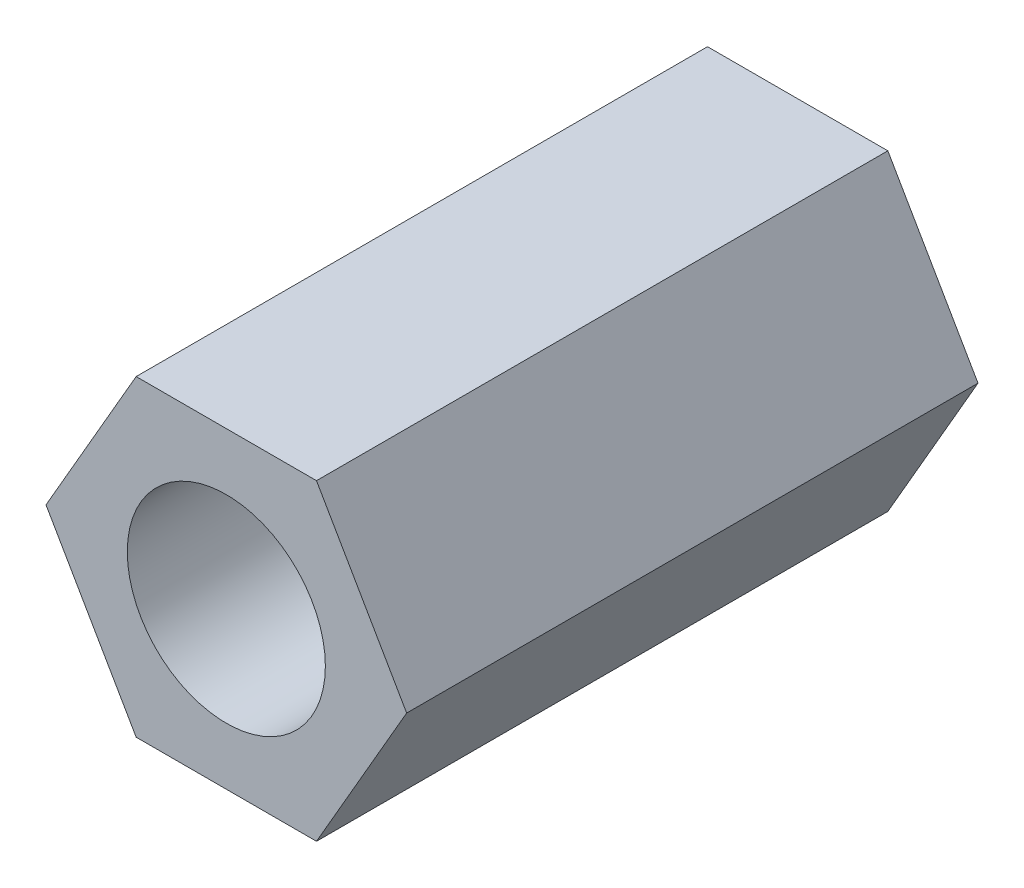
ISO-10303-21;
HEADER;
FILE_DESCRIPTION(('STEP AP214'),'2;1');
FILE_NAME('part.step','',(''),(''),'','','');
FILE_SCHEMA(('AUTOMOTIVE_DESIGN { 1 0 10303 214 1 1 1 1 }'));
ENDSEC;
DATA;
#1=APPLICATION_CONTEXT('core data for automotive mechanical design processes');
#2=APPLICATION_PROTOCOL_DEFINITION('international standard','automotive_design',2000,#1);
#3=PRODUCT_CONTEXT('',#1,'mechanical');
#4=PRODUCT('Part','Part','',(#3));
#5=PRODUCT_RELATED_PRODUCT_CATEGORY('part','',(#4));
#6=PRODUCT_DEFINITION_FORMATION('','',#4);
#7=PRODUCT_DEFINITION_CONTEXT('part definition',#1,'design');
#8=PRODUCT_DEFINITION('design','',#6,#7);
#9=PRODUCT_DEFINITION_SHAPE('','',#8);
#10=(LENGTH_UNIT() NAMED_UNIT(*) SI_UNIT(.MILLI.,.METRE.));
#11=(NAMED_UNIT(*) PLANE_ANGLE_UNIT() SI_UNIT($,.RADIAN.));
#12=(NAMED_UNIT(*) SI_UNIT($,.STERADIAN.) SOLID_ANGLE_UNIT());
#13=UNCERTAINTY_MEASURE_WITH_UNIT(LENGTH_MEASURE(1.E-05),#10,'distance_accuracy_value','');
#14=(GEOMETRIC_REPRESENTATION_CONTEXT(3) GLOBAL_UNCERTAINTY_ASSIGNED_CONTEXT((#13)) GLOBAL_UNIT_ASSIGNED_CONTEXT((#10,
#11,#12)) REPRESENTATION_CONTEXT('',''));
#15=CARTESIAN_POINT('',(0.,0.,0.));
#16=DIRECTION('',(0.,0.,1.));
#17=DIRECTION('',(1.,0.,0.));
#18=AXIS2_PLACEMENT_3D('',#15,#16,#17);
#19=CARTESIAN_POINT('',(-11.8356805183873,20.5,75.));
#20=DIRECTION('',(0.866025403784438,-0.5,0.));
#21=DIRECTION('',(0.5,0.866025403784439,0.));
#22=AXIS2_PLACEMENT_3D('',#19,#20,#21);
#23=PLANE('',#22);
#24=DIRECTION('',(-0.5,-0.866025403784439,0.));
#25=VECTOR('',#24,1.);
#26=CARTESIAN_POINT('',(-11.8356805183873,20.5,0.));
#27=LINE('',#26,#25);
#28=CARTESIAN_POINT('',(-11.8356805183873,20.5,0.));
#29=VERTEX_POINT('',#28);
#30=CARTESIAN_POINT('',(-23.6713610367747,0.,0.));
#31=VERTEX_POINT('',#30);
#32=EDGE_CURVE('E120',#29,#31,#27,.T.);
#33=ORIENTED_EDGE('',*,*,#32,.T.);
#34=DIRECTION('',(0.,0.,-1.));
#35=VECTOR('',#34,1.);
#36=CARTESIAN_POINT('',(-23.6713610367747,0.,75.));
#37=LINE('',#36,#35);
#38=CARTESIAN_POINT('',(-23.6713610367747,0.,75.));
#39=VERTEX_POINT('',#38);
#40=EDGE_CURVE('E11',#39,#31,#37,.T.);
#41=ORIENTED_EDGE('',*,*,#40,.F.);
#42=DIRECTION('',(-0.5,-0.866025403784439,0.));
#43=VECTOR('',#42,1.);
#44=CARTESIAN_POINT('',(-11.8356805183873,20.5,75.));
#45=LINE('',#44,#43);
#46=CARTESIAN_POINT('',(-11.8356805183873,20.5,75.));
#47=VERTEX_POINT('',#46);
#48=EDGE_CURVE('E131',#47,#39,#45,.T.);
#49=ORIENTED_EDGE('',*,*,#48,.F.);
#50=DIRECTION('',(0.,0.,-1.));
#51=VECTOR('',#50,1.);
#52=CARTESIAN_POINT('',(-11.8356805183873,20.5,75.));
#53=LINE('',#52,#51);
#54=EDGE_CURVE('E116',#47,#29,#53,.T.);
#55=ORIENTED_EDGE('',*,*,#54,.T.);
#56=EDGE_LOOP('',(#33,#41,#49,#55));
#57=FACE_BOUND('',#56,.T.);
#58=ADVANCED_FACE('F36',(#57),#23,.F.);
#59=CARTESIAN_POINT('',(-23.6713610367747,0.,75.));
#60=DIRECTION('',(0.866025403784439,0.5,0.));
#61=DIRECTION('',(-0.5,0.866025403784439,0.));
#62=AXIS2_PLACEMENT_3D('',#59,#60,#61);
#63=PLANE('',#62);
#64=DIRECTION('',(0.5,-0.866025403784439,0.));
#65=VECTOR('',#64,1.);
#66=CARTESIAN_POINT('',(-23.6713610367747,0.,0.));
#67=LINE('',#66,#65);
#68=CARTESIAN_POINT('',(-11.8356805183873,-20.5,0.));
#69=VERTEX_POINT('',#68);
#70=EDGE_CURVE('E123',#31,#69,#67,.T.);
#71=ORIENTED_EDGE('',*,*,#70,.T.);
#72=DIRECTION('',(0.,0.,-1.));
#73=VECTOR('',#72,1.);
#74=CARTESIAN_POINT('',(-11.8356805183873,-20.5,75.));
#75=LINE('',#74,#73);
#76=CARTESIAN_POINT('',(-11.8356805183873,-20.5,75.));
#77=VERTEX_POINT('',#76);
#78=EDGE_CURVE('E44',#77,#69,#75,.T.);
#79=ORIENTED_EDGE('',*,*,#78,.F.);
#80=DIRECTION('',(0.5,-0.866025403784439,0.));
#81=VECTOR('',#80,1.);
#82=CARTESIAN_POINT('',(-23.6713610367747,0.,75.));
#83=LINE('',#82,#81);
#84=EDGE_CURVE('E89',#39,#77,#83,.T.);
#85=ORIENTED_EDGE('',*,*,#84,.F.);
#86=ORIENTED_EDGE('',*,*,#40,.T.);
#87=EDGE_LOOP('',(#71,#79,#85,#86));
#88=FACE_BOUND('',#87,.T.);
#89=ADVANCED_FACE('F156',(#88),#63,.F.);
#90=CARTESIAN_POINT('',(-11.8356805183873,-20.5,75.));
#91=DIRECTION('',(0.,1.,0.));
#92=DIRECTION('',(-1.,0.,0.));
#93=AXIS2_PLACEMENT_3D('',#90,#91,#92);
#94=PLANE('',#93);
#95=DIRECTION('',(1.,0.,0.));
#96=VECTOR('',#95,1.);
#97=CARTESIAN_POINT('',(-11.8356805183873,-20.5,0.));
#98=LINE('',#97,#96);
#99=CARTESIAN_POINT('',(11.8356805183873,-20.5,0.));
#100=VERTEX_POINT('',#99);
#101=EDGE_CURVE('E126',#69,#100,#98,.T.);
#102=ORIENTED_EDGE('',*,*,#101,.T.);
#103=DIRECTION('',(0.,0.,-1.));
#104=VECTOR('',#103,1.);
#105=CARTESIAN_POINT('',(11.8356805183873,-20.5,75.));
#106=LINE('',#105,#104);
#107=CARTESIAN_POINT('',(11.8356805183873,-20.5,75.));
#108=VERTEX_POINT('',#107);
#109=EDGE_CURVE('E111',#108,#100,#106,.T.);
#110=ORIENTED_EDGE('',*,*,#109,.F.);
#111=DIRECTION('',(1.,0.,0.));
#112=VECTOR('',#111,1.);
#113=CARTESIAN_POINT('',(-11.8356805183873,-20.5,75.));
#114=LINE('',#113,#112);
#115=EDGE_CURVE('E102',#77,#108,#114,.T.);
#116=ORIENTED_EDGE('',*,*,#115,.F.);
#117=ORIENTED_EDGE('',*,*,#78,.T.);
#118=EDGE_LOOP('',(#102,#110,#116,#117));
#119=FACE_BOUND('',#118,.T.);
#120=ADVANCED_FACE('F137',(#119),#94,.F.);
#121=CARTESIAN_POINT('',(11.8356805183873,-20.5,75.));
#122=DIRECTION('',(-0.866025403784439,0.5,0.));
#123=DIRECTION('',(-0.5,-0.866025403784439,0.));
#124=AXIS2_PLACEMENT_3D('',#121,#122,#123);
#125=PLANE('',#124);
#126=DIRECTION('',(0.5,0.866025403784439,0.));
#127=VECTOR('',#126,1.);
#128=CARTESIAN_POINT('',(11.8356805183873,-20.5,0.));
#129=LINE('',#128,#127);
#130=CARTESIAN_POINT('',(23.6713610367746,0.,0.));
#131=VERTEX_POINT('',#130);
#132=EDGE_CURVE('E110',#100,#131,#129,.T.);
#133=ORIENTED_EDGE('',*,*,#132,.T.);
#134=DIRECTION('',(0.,0.,-1.));
#135=VECTOR('',#134,1.);
#136=CARTESIAN_POINT('',(23.6713610367746,0.,75.));
#137=LINE('',#136,#135);
#138=CARTESIAN_POINT('',(23.6713610367746,0.,75.));
#139=VERTEX_POINT('',#138);
#140=EDGE_CURVE('E107',#139,#131,#137,.T.);
#141=ORIENTED_EDGE('',*,*,#140,.F.);
#142=DIRECTION('',(0.5,0.866025403784439,0.));
#143=VECTOR('',#142,1.);
#144=CARTESIAN_POINT('',(11.8356805183873,-20.5,75.));
#145=LINE('',#144,#143);
#146=EDGE_CURVE('E96',#108,#139,#145,.T.);
#147=ORIENTED_EDGE('',*,*,#146,.F.);
#148=ORIENTED_EDGE('',*,*,#109,.T.);
#149=EDGE_LOOP('',(#133,#141,#147,#148));
#150=FACE_BOUND('',#149,.T.);
#151=ADVANCED_FACE('F108',(#150),#125,.F.);
#152=CARTESIAN_POINT('',(23.6713610367746,0.,75.));
#153=DIRECTION('',(-0.866025403784439,-0.5,0.));
#154=DIRECTION('',(0.5,-0.866025403784439,0.));
#155=AXIS2_PLACEMENT_3D('',#152,#153,#154);
#156=PLANE('',#155);
#157=DIRECTION('',(-0.5,0.866025403784439,0.));
#158=VECTOR('',#157,1.);
#159=CARTESIAN_POINT('',(23.6713610367746,0.,0.));
#160=LINE('',#159,#158);
#161=CARTESIAN_POINT('',(11.8356805183873,20.5,0.));
#162=VERTEX_POINT('',#161);
#163=EDGE_CURVE('E75',#131,#162,#160,.T.);
#164=ORIENTED_EDGE('',*,*,#163,.T.);
#165=DIRECTION('',(0.,0.,-1.));
#166=VECTOR('',#165,1.);
#167=CARTESIAN_POINT('',(11.8356805183873,20.5,75.));
#168=LINE('',#167,#166);
#169=CARTESIAN_POINT('',(11.8356805183873,20.5,75.));
#170=VERTEX_POINT('',#169);
#171=EDGE_CURVE('E112',#170,#162,#168,.T.);
#172=ORIENTED_EDGE('',*,*,#171,.F.);
#173=DIRECTION('',(-0.5,0.866025403784439,0.));
#174=VECTOR('',#173,1.);
#175=CARTESIAN_POINT('',(23.6713610367746,0.,75.));
#176=LINE('',#175,#174);
#177=EDGE_CURVE('E100',#139,#170,#176,.T.);
#178=ORIENTED_EDGE('',*,*,#177,.F.);
#179=ORIENTED_EDGE('',*,*,#140,.T.);
#180=EDGE_LOOP('',(#164,#172,#178,#179));
#181=FACE_BOUND('',#180,.T.);
#182=ADVANCED_FACE('F114',(#181),#156,.F.);
#183=CARTESIAN_POINT('',(11.8356805183873,20.5,75.));
#184=DIRECTION('',(0.,-1.,0.));
#185=DIRECTION('',(1.,0.,0.));
#186=AXIS2_PLACEMENT_3D('',#183,#184,#185);
#187=PLANE('',#186);
#188=DIRECTION('',(-1.,0.,0.));
#189=VECTOR('',#188,1.);
#190=CARTESIAN_POINT('',(11.8356805183873,20.5,0.));
#191=LINE('',#190,#189);
#192=EDGE_CURVE('E81',#162,#29,#191,.T.);
#193=ORIENTED_EDGE('',*,*,#192,.T.);
#194=ORIENTED_EDGE('',*,*,#54,.F.);
#195=DIRECTION('',(-1.,0.,0.));
#196=VECTOR('',#195,1.);
#197=CARTESIAN_POINT('',(11.8356805183873,20.5,75.));
#198=LINE('',#197,#196);
#199=EDGE_CURVE('E52',#170,#47,#198,.T.);
#200=ORIENTED_EDGE('',*,*,#199,.F.);
#201=ORIENTED_EDGE('',*,*,#171,.T.);
#202=EDGE_LOOP('',(#193,#194,#200,#201));
#203=FACE_BOUND('',#202,.T.);
#204=ADVANCED_FACE('F144',(#203),#187,.F.);
#205=CARTESIAN_POINT('',(-23.6713610367747,0.,75.));
#206=DIRECTION('',(0.,0.,1.));
#207=DIRECTION('',(1.,0.,0.));
#208=AXIS2_PLACEMENT_3D('',#205,#206,#207);
#209=PLANE('',#208);
#210=CARTESIAN_POINT('',(0.,0.,75.));
#211=DIRECTION('',(0.,0.,1.));
#212=DIRECTION('',(1.,0.,0.));
#213=AXIS2_PLACEMENT_3D('',#210,#211,#212);
#214=CIRCLE('',#213,13.);
#215=CARTESIAN_POINT('',(13.,0.,75.));
#216=VERTEX_POINT('',#215);
#217=EDGE_CURVE('E233',#216,#216,#214,.T.);
#218=ORIENTED_EDGE('',*,*,#217,.F.);
#219=EDGE_LOOP('',(#218));
#220=FACE_BOUND('',#219,.T.);
#221=ORIENTED_EDGE('',*,*,#48,.T.);
#222=ORIENTED_EDGE('',*,*,#84,.T.);
#223=ORIENTED_EDGE('',*,*,#115,.T.);
#224=ORIENTED_EDGE('',*,*,#146,.T.);
#225=ORIENTED_EDGE('',*,*,#177,.T.);
#226=ORIENTED_EDGE('',*,*,#199,.T.);
#227=EDGE_LOOP('',(#221,#222,#223,#224,#225,#226));
#228=FACE_BOUND('',#227,.T.);
#229=ADVANCED_FACE('F98',(#220,#228),#209,.T.);
#230=CARTESIAN_POINT('',(-23.6713610367747,0.,0.));
#231=DIRECTION('',(0.,0.,1.));
#232=DIRECTION('',(1.,0.,0.));
#233=AXIS2_PLACEMENT_3D('',#230,#231,#232);
#234=PLANE('',#233);
#235=CARTESIAN_POINT('',(0.,0.,0.));
#236=DIRECTION('',(0.,0.,1.));
#237=DIRECTION('',(1.,0.,0.));
#238=AXIS2_PLACEMENT_3D('',#235,#236,#237);
#239=CIRCLE('',#238,11.1);
#240=CARTESIAN_POINT('',(11.1,0.,0.));
#241=VERTEX_POINT('',#240);
#242=EDGE_CURVE('E232',#241,#241,#239,.T.);
#243=ORIENTED_EDGE('',*,*,#242,.T.);
#244=EDGE_LOOP('',(#243));
#245=FACE_BOUND('',#244,.T.);
#246=ORIENTED_EDGE('',*,*,#32,.F.);
#247=ORIENTED_EDGE('',*,*,#192,.F.);
#248=ORIENTED_EDGE('',*,*,#163,.F.);
#249=ORIENTED_EDGE('',*,*,#132,.F.);
#250=ORIENTED_EDGE('',*,*,#101,.F.);
#251=ORIENTED_EDGE('',*,*,#70,.F.);
#252=EDGE_LOOP('',(#246,#247,#248,#249,#250,#251));
#253=FACE_BOUND('',#252,.T.);
#254=ADVANCED_FACE('F140',(#245,#253),#234,.F.);
#255=CARTESIAN_POINT('',(0.,0.,29.));
#256=DIRECTION('',(0.,0.,1.));
#257=DIRECTION('',(1.,0.,0.));
#258=AXIS2_PLACEMENT_3D('',#255,#256,#257);
#259=CYLINDRICAL_SURFACE('',#258,13.);
#260=CARTESIAN_POINT('',(0.,0.,29.));
#261=DIRECTION('',(0.,0.,1.));
#262=DIRECTION('',(1.,0.,0.));
#263=AXIS2_PLACEMENT_3D('',#260,#261,#262);
#264=CIRCLE('',#263,13.);
#265=CARTESIAN_POINT('',(13.,0.,29.));
#266=VERTEX_POINT('',#265);
#267=EDGE_CURVE('E124',#266,#266,#264,.T.);
#268=ORIENTED_EDGE('',*,*,#267,.F.);
#269=EDGE_LOOP('',(#268));
#270=FACE_BOUND('',#269,.T.);
#271=ORIENTED_EDGE('',*,*,#217,.T.);
#272=EDGE_LOOP('',(#271));
#273=FACE_BOUND('',#272,.T.);
#274=ADVANCED_FACE('F191',(#270,#273),#259,.F.);
#275=CARTESIAN_POINT('',(0.,0.,29.));
#276=DIRECTION('',(0.,0.,1.));
#277=DIRECTION('',(1.,0.,0.));
#278=AXIS2_PLACEMENT_3D('',#275,#276,#277);
#279=PLANE('',#278);
#280=CARTESIAN_POINT('',(0.,0.,29.));
#281=DIRECTION('',(0.,0.,1.));
#282=DIRECTION('',(1.,0.,0.));
#283=AXIS2_PLACEMENT_3D('',#280,#281,#282);
#284=CIRCLE('',#283,11.1);
#285=CARTESIAN_POINT('',(11.1,0.,29.));
#286=VERTEX_POINT('',#285);
#287=EDGE_CURVE('E229',#286,#286,#284,.T.);
#288=ORIENTED_EDGE('',*,*,#287,.F.);
#289=EDGE_LOOP('',(#288));
#290=FACE_BOUND('',#289,.T.);
#291=ORIENTED_EDGE('',*,*,#267,.T.);
#292=EDGE_LOOP('',(#291));
#293=FACE_BOUND('',#292,.T.);
#294=ADVANCED_FACE('F196',(#290,#293),#279,.T.);
#295=CARTESIAN_POINT('',(0.,0.,-34.));
#296=DIRECTION('',(0.,0.,1.));
#297=DIRECTION('',(1.,0.,0.));
#298=AXIS2_PLACEMENT_3D('',#295,#296,#297);
#299=CYLINDRICAL_SURFACE('',#298,11.1);
#300=ORIENTED_EDGE('',*,*,#287,.T.);
#301=EDGE_LOOP('',(#300));
#302=FACE_BOUND('',#301,.T.);
#303=ORIENTED_EDGE('',*,*,#242,.F.);
#304=EDGE_LOOP('',(#303));
#305=FACE_BOUND('',#304,.T.);
#306=ADVANCED_FACE('F212',(#302,#305),#299,.F.);
#307=CLOSED_SHELL('',(#58,#89,#120,#151,#182,#204,#229,#254,#274,#294,#306));
#308=MANIFOLD_SOLID_BREP('B2',#307);
#309=ADVANCED_BREP_SHAPE_REPRESENTATION('',(#18,#308),#14);
#310=SHAPE_DEFINITION_REPRESENTATION(#9,#309);
ENDSEC;
END-ISO-10303-21;
